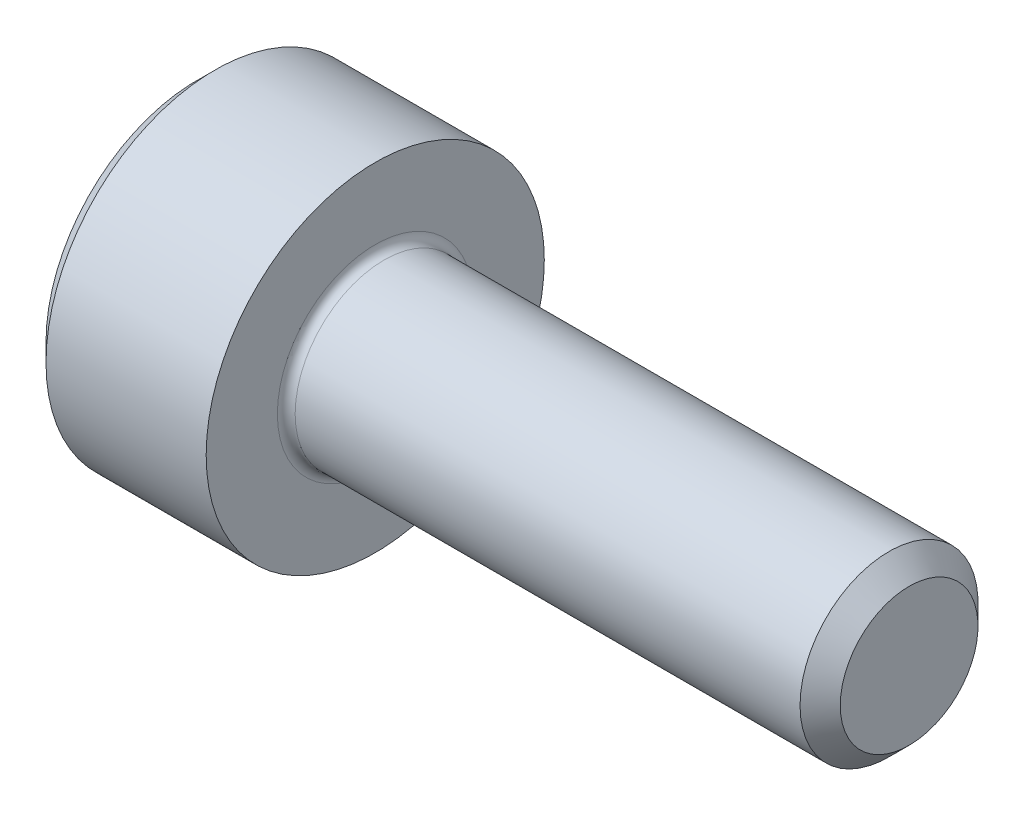
ISO-10303-21;
HEADER;
FILE_DESCRIPTION(('STEP AP214'),'2;1');
FILE_NAME('part.step','',(''),(''),'','','');
FILE_SCHEMA(('AUTOMOTIVE_DESIGN { 1 0 10303 214 1 1 1 1 }'));
ENDSEC;
DATA;
#1=APPLICATION_CONTEXT('core data for automotive mechanical design processes');
#2=APPLICATION_PROTOCOL_DEFINITION('international standard','automotive_design',2000,#1);
#3=PRODUCT_CONTEXT('',#1,'mechanical');
#4=PRODUCT('Part','Part','',(#3));
#5=PRODUCT_RELATED_PRODUCT_CATEGORY('part','',(#4));
#6=PRODUCT_DEFINITION_FORMATION('','',#4);
#7=PRODUCT_DEFINITION_CONTEXT('part definition',#1,'design');
#8=PRODUCT_DEFINITION('design','',#6,#7);
#9=PRODUCT_DEFINITION_SHAPE('','',#8);
#10=(LENGTH_UNIT() NAMED_UNIT(*) SI_UNIT(.MILLI.,.METRE.));
#11=(NAMED_UNIT(*) PLANE_ANGLE_UNIT() SI_UNIT($,.RADIAN.));
#12=(NAMED_UNIT(*) SI_UNIT($,.STERADIAN.) SOLID_ANGLE_UNIT());
#13=UNCERTAINTY_MEASURE_WITH_UNIT(LENGTH_MEASURE(1.E-05),#10,'distance_accuracy_value','');
#14=(GEOMETRIC_REPRESENTATION_CONTEXT(3) GLOBAL_UNCERTAINTY_ASSIGNED_CONTEXT((#13)) GLOBAL_UNIT_ASSIGNED_CONTEXT((#10,
#11,#12)) REPRESENTATION_CONTEXT('',''));
#15=CARTESIAN_POINT('',(0.,0.,0.));
#16=DIRECTION('',(0.,0.,1.));
#17=DIRECTION('',(1.,0.,0.));
#18=AXIS2_PLACEMENT_3D('',#15,#16,#17);
#19=CARTESIAN_POINT('',(0.,0.,0.));
#20=DIRECTION('',(-1.,0.,0.));
#21=DIRECTION('',(0.,0.,1.));
#22=AXIS2_PLACEMENT_3D('',#19,#20,#21);
#23=PLANE('',#22);
#24=DIRECTION('',(0.,-0.499999999999999,0.866025403784439));
#25=VECTOR('',#24,1.);
#26=CARTESIAN_POINT('',(0.,0.892006165897969,0.));
#27=LINE('',#26,#25);
#28=CARTESIAN_POINT('',(0.,0.892006165897969,0.));
#29=VERTEX_POINT('',#28);
#30=CARTESIAN_POINT('',(0.,0.446003082948983,0.772499999999997));
#31=VERTEX_POINT('',#30);
#32=EDGE_CURVE('E387',#29,#31,#27,.T.);
#33=ORIENTED_EDGE('',*,*,#32,.T.);
#34=DIRECTION('',(0.,1.,0.));
#35=VECTOR('',#34,1.);
#36=CARTESIAN_POINT('',(0.,-0.446003082948989,0.772499999999998));
#37=LINE('',#36,#35);
#38=CARTESIAN_POINT('',(0.,-0.446003082948989,0.772499999999998));
#39=VERTEX_POINT('',#38);
#40=EDGE_CURVE('E131',#39,#31,#37,.T.);
#41=ORIENTED_EDGE('',*,*,#40,.F.);
#42=DIRECTION('',(0.,-0.500000000000001,-0.866025403784438));
#43=VECTOR('',#42,1.);
#44=CARTESIAN_POINT('',(0.,-0.446003082948989,0.772499999999998));
#45=LINE('',#44,#43);
#46=CARTESIAN_POINT('',(0.,-0.892006165897975,0.));
#47=VERTEX_POINT('',#46);
#48=EDGE_CURVE('E390',#39,#47,#45,.T.);
#49=ORIENTED_EDGE('',*,*,#48,.T.);
#50=DIRECTION('',(0.,0.499999999999999,-0.866025403784439));
#51=VECTOR('',#50,1.);
#52=CARTESIAN_POINT('',(0.,-0.892006165897975,0.));
#53=LINE('',#52,#51);
#54=CARTESIAN_POINT('',(0.,-0.44600308294899,-0.772500000000001));
#55=VERTEX_POINT('',#54);
#56=EDGE_CURVE('E393',#47,#55,#53,.T.);
#57=ORIENTED_EDGE('',*,*,#56,.T.);
#58=DIRECTION('',(0.,-1.,0.));
#59=VECTOR('',#58,1.);
#60=CARTESIAN_POINT('',(0.,0.446003082948982,-0.772500000000003));
#61=LINE('',#60,#59);
#62=CARTESIAN_POINT('',(0.,0.446003082948982,-0.772500000000003));
#63=VERTEX_POINT('',#62);
#64=EDGE_CURVE('E396',#63,#55,#61,.T.);
#65=ORIENTED_EDGE('',*,*,#64,.F.);
#66=DIRECTION('',(0.,-0.500000000000001,-0.866025403784438));
#67=VECTOR('',#66,1.);
#68=CARTESIAN_POINT('',(0.,0.892006165897969,0.));
#69=LINE('',#68,#67);
#70=EDGE_CURVE('E126',#29,#63,#69,.T.);
#71=ORIENTED_EDGE('',*,*,#70,.F.);
#72=EDGE_LOOP('',(#33,#41,#49,#57,#65,#71));
#73=FACE_BOUND('',#72,.T.);
#74=CARTESIAN_POINT('',(0.,0.,0.));
#75=DIRECTION('',(-1.,0.,0.));
#76=DIRECTION('',(0.,0.,1.));
#77=AXIS2_PLACEMENT_3D('',#74,#75,#76);
#78=CIRCLE('',#77,1.70000000000001);
#79=CARTESIAN_POINT('',(0.,0.,1.70000000000001));
#80=VERTEX_POINT('',#79);
#81=EDGE_CURVE('E142',#80,#80,#78,.T.);
#82=ORIENTED_EDGE('',*,*,#81,.T.);
#83=EDGE_LOOP('',(#82));
#84=FACE_BOUND('',#83,.T.);
#85=ADVANCED_FACE('F35',(#73,#84),#23,.T.);
#86=CARTESIAN_POINT('',(8.,0.774,0.));
#87=DIRECTION('',(1.,0.,0.));
#88=DIRECTION('',(0.,0.,-1.));
#89=AXIS2_PLACEMENT_3D('',#86,#87,#88);
#90=PLANE('',#89);
#91=CARTESIAN_POINT('',(8.,0.,0.));
#92=DIRECTION('',(-1.,0.,0.));
#93=DIRECTION('',(0.,0.,1.));
#94=AXIS2_PLACEMENT_3D('',#91,#92,#93);
#95=CIRCLE('',#94,0.774);
#96=CARTESIAN_POINT('',(8.,0.,0.774));
#97=VERTEX_POINT('',#96);
#98=EDGE_CURVE('E155',#97,#97,#95,.T.);
#99=ORIENTED_EDGE('',*,*,#98,.F.);
#100=EDGE_LOOP('',(#99));
#101=FACE_BOUND('',#100,.T.);
#102=ADVANCED_FACE('F176',(#101),#90,.T.);
#103=CARTESIAN_POINT('',(8.,0.,0.));
#104=DIRECTION('',(-1.,0.,0.));
#105=DIRECTION('',(0.,0.,1.));
#106=AXIS2_PLACEMENT_3D('',#103,#104,#105);
#107=CONICAL_SURFACE('',#106,0.774,0.785398163397411);
#108=CARTESIAN_POINT('',(7.774,0.,0.));
#109=DIRECTION('',(-1.,0.,0.));
#110=DIRECTION('',(0.,0.,1.));
#111=AXIS2_PLACEMENT_3D('',#108,#109,#110);
#112=CIRCLE('',#111,0.999999999999987);
#113=CARTESIAN_POINT('',(7.774,0.,0.999999999999987));
#114=VERTEX_POINT('',#113);
#115=EDGE_CURVE('E152',#114,#114,#112,.T.);
#116=ORIENTED_EDGE('',*,*,#115,.F.);
#117=EDGE_LOOP('',(#116));
#118=FACE_BOUND('',#117,.T.);
#119=ORIENTED_EDGE('',*,*,#98,.T.);
#120=EDGE_LOOP('',(#119));
#121=FACE_BOUND('',#120,.T.);
#122=ADVANCED_FACE('F182',(#118,#121),#107,.T.);
#123=CARTESIAN_POINT('',(-31.75,0.,0.));
#124=DIRECTION('',(-1.,0.,0.));
#125=DIRECTION('',(0.,0.,1.));
#126=AXIS2_PLACEMENT_3D('',#123,#124,#125);
#127=CYLINDRICAL_SURFACE('',#126,0.999999999999994);
#128=CARTESIAN_POINT('',(2.1,0.,0.));
#129=DIRECTION('',(1.,0.,0.));
#130=DIRECTION('',(0.,0.,-1.));
#131=AXIS2_PLACEMENT_3D('',#128,#129,#130);
#132=CIRCLE('',#131,0.999999999999994);
#133=CARTESIAN_POINT('',(2.1,0.,-0.999999999999994));
#134=VERTEX_POINT('',#133);
#135=EDGE_CURVE('E11',#134,#134,#132,.T.);
#136=ORIENTED_EDGE('',*,*,#135,.T.);
#137=EDGE_LOOP('',(#136));
#138=FACE_BOUND('',#137,.T.);
#139=ORIENTED_EDGE('',*,*,#115,.T.);
#140=EDGE_LOOP('',(#139));
#141=FACE_BOUND('',#140,.T.);
#142=ADVANCED_FACE('F193',(#138,#141),#127,.T.);
#143=CARTESIAN_POINT('',(2.,1.9,0.));
#144=DIRECTION('',(1.,0.,0.));
#145=DIRECTION('',(0.,0.,-1.));
#146=AXIS2_PLACEMENT_3D('',#143,#144,#145);
#147=PLANE('',#146);
#148=CARTESIAN_POINT('',(2.,0.,0.));
#149=DIRECTION('',(1.,0.,0.));
#150=DIRECTION('',(0.,0.,-1.));
#151=AXIS2_PLACEMENT_3D('',#148,#149,#150);
#152=CIRCLE('',#151,1.09999999999999);
#153=CARTESIAN_POINT('',(2.,0.,-1.09999999999999));
#154=VERTEX_POINT('',#153);
#155=EDGE_CURVE('E43',#154,#154,#152,.F.);
#156=ORIENTED_EDGE('',*,*,#155,.T.);
#157=EDGE_LOOP('',(#156));
#158=FACE_BOUND('',#157,.T.);
#159=CARTESIAN_POINT('',(2.,0.,0.));
#160=DIRECTION('',(-1.,0.,0.));
#161=DIRECTION('',(0.,0.,1.));
#162=AXIS2_PLACEMENT_3D('',#159,#160,#161);
#163=CIRCLE('',#162,1.9);
#164=CARTESIAN_POINT('',(2.,0.,1.9));
#165=VERTEX_POINT('',#164);
#166=EDGE_CURVE('E149',#165,#165,#163,.T.);
#167=ORIENTED_EDGE('',*,*,#166,.F.);
#168=EDGE_LOOP('',(#167));
#169=FACE_BOUND('',#168,.T.);
#170=ADVANCED_FACE('F160',(#158,#169),#147,.T.);
#171=CARTESIAN_POINT('',(-31.75,0.,0.));
#172=DIRECTION('',(-1.,0.,0.));
#173=DIRECTION('',(0.,0.,1.));
#174=AXIS2_PLACEMENT_3D('',#171,#172,#173);
#175=CYLINDRICAL_SURFACE('',#174,1.9);
#176=ORIENTED_EDGE('',*,*,#166,.T.);
#177=EDGE_LOOP('',(#176));
#178=FACE_BOUND('',#177,.T.);
#179=CARTESIAN_POINT('',(0.199999999999999,0.,0.));
#180=DIRECTION('',(-1.,0.,0.));
#181=DIRECTION('',(0.,0.,1.));
#182=AXIS2_PLACEMENT_3D('',#179,#180,#181);
#183=CIRCLE('',#182,1.9);
#184=CARTESIAN_POINT('',(0.199999999999999,0.,1.9));
#185=VERTEX_POINT('',#184);
#186=EDGE_CURVE('E146',#185,#185,#183,.T.);
#187=ORIENTED_EDGE('',*,*,#186,.F.);
#188=EDGE_LOOP('',(#187));
#189=FACE_BOUND('',#188,.T.);
#190=ADVANCED_FACE('F171',(#178,#189),#175,.T.);
#191=CARTESIAN_POINT('',(0.,0.,0.));
#192=DIRECTION('',(1.,0.,0.));
#193=DIRECTION('',(0.,0.,-1.));
#194=AXIS2_PLACEMENT_3D('',#191,#192,#193);
#195=CONICAL_SURFACE('',#194,1.70000000000001,0.785398163397435);
#196=ORIENTED_EDGE('',*,*,#186,.T.);
#197=EDGE_LOOP('',(#196));
#198=FACE_BOUND('',#197,.T.);
#199=ORIENTED_EDGE('',*,*,#81,.F.);
#200=EDGE_LOOP('',(#199));
#201=FACE_BOUND('',#200,.T.);
#202=ADVANCED_FACE('F164',(#198,#201),#195,.T.);
#203=CARTESIAN_POINT('',(2.1,0.,0.));
#204=DIRECTION('',(1.,0.,0.));
#205=DIRECTION('',(0.,0.,-1.));
#206=AXIS2_PLACEMENT_3D('',#203,#204,#205);
#207=TOROIDAL_SURFACE('',#206,1.09999999999999,0.1);
#208=ORIENTED_EDGE('',*,*,#135,.F.);
#209=EDGE_LOOP('',(#208));
#210=FACE_BOUND('',#209,.T.);
#211=ORIENTED_EDGE('',*,*,#155,.F.);
#212=EDGE_LOOP('',(#211));
#213=FACE_BOUND('',#212,.T.);
#214=ADVANCED_FACE('F37',(#210,#213),#207,.F.);
#215=CARTESIAN_POINT('',(1.,0.892006165897969,0.));
#216=DIRECTION('',(0.,-0.866025403784439,-0.499999999999999));
#217=DIRECTION('',(0.,0.499999999999999,-0.866025403784439));
#218=AXIS2_PLACEMENT_3D('',#215,#216,#217);
#219=PLANE('',#218);
#220=ORIENTED_EDGE('',*,*,#32,.F.);
#221=DIRECTION('',(-1.,0.,0.));
#222=VECTOR('',#221,1.);
#223=CARTESIAN_POINT('',(1.,0.892006165897969,0.));
#224=LINE('',#223,#222);
#225=CARTESIAN_POINT('',(1.,0.892006165897969,0.));
#226=VERTEX_POINT('',#225);
#227=EDGE_CURVE('E377',#226,#29,#224,.T.);
#228=ORIENTED_EDGE('',*,*,#227,.F.);
#229=DIRECTION('',(0.,-0.499999999999999,0.866025403784439));
#230=VECTOR('',#229,1.);
#231=CARTESIAN_POINT('',(1.,0.892006165897969,0.));
#232=LINE('',#231,#230);
#233=CARTESIAN_POINT('',(1.,0.669004624423476,0.386249999999998));
#234=VERTEX_POINT('',#233);
#235=EDGE_CURVE('E118',#226,#234,#232,.T.);
#236=ORIENTED_EDGE('',*,*,#235,.T.);
#237=CARTESIAN_POINT('',(1.,0.446003082948983,0.772499999999997));
#238=VERTEX_POINT('',#237);
#239=EDGE_CURVE('E109',#234,#238,#232,.T.);
#240=ORIENTED_EDGE('',*,*,#239,.T.);
#241=DIRECTION('',(-1.,0.,0.));
#242=VECTOR('',#241,1.);
#243=CARTESIAN_POINT('',(1.,0.446003082948983,0.772499999999997));
#244=LINE('',#243,#242);
#245=EDGE_CURVE('E123',#238,#31,#244,.T.);
#246=ORIENTED_EDGE('',*,*,#245,.T.);
#247=EDGE_LOOP('',(#220,#228,#236,#240,#246));
#248=FACE_BOUND('',#247,.T.);
#249=ADVANCED_FACE('F122',(#248),#219,.T.);
#250=CARTESIAN_POINT('',(1.,-0.446003082948989,0.772499999999998));
#251=DIRECTION('',(0.,0.,1.));
#252=DIRECTION('',(0.,-1.,0.));
#253=AXIS2_PLACEMENT_3D('',#250,#251,#252);
#254=PLANE('',#253);
#255=ORIENTED_EDGE('',*,*,#40,.T.);
#256=ORIENTED_EDGE('',*,*,#245,.F.);
#257=DIRECTION('',(0.,1.,0.));
#258=VECTOR('',#257,1.);
#259=CARTESIAN_POINT('',(1.,-0.446003082948989,0.772499999999998));
#260=LINE('',#259,#258);
#261=CARTESIAN_POINT('',(1.,0.,0.772499999999998));
#262=VERTEX_POINT('',#261);
#263=EDGE_CURVE('E106',#262,#238,#260,.T.);
#264=ORIENTED_EDGE('',*,*,#263,.F.);
#265=CARTESIAN_POINT('',(1.,-0.446003082948989,0.772499999999998));
#266=VERTEX_POINT('',#265);
#267=EDGE_CURVE('E117',#266,#262,#260,.T.);
#268=ORIENTED_EDGE('',*,*,#267,.F.);
#269=DIRECTION('',(-1.,0.,0.));
#270=VECTOR('',#269,1.);
#271=CARTESIAN_POINT('',(1.,-0.446003082948989,0.772499999999998));
#272=LINE('',#271,#270);
#273=EDGE_CURVE('E133',#266,#39,#272,.T.);
#274=ORIENTED_EDGE('',*,*,#273,.T.);
#275=EDGE_LOOP('',(#255,#256,#264,#268,#274));
#276=FACE_BOUND('',#275,.T.);
#277=ADVANCED_FACE('F128',(#276),#254,.F.);
#278=CARTESIAN_POINT('',(1.,-0.446003082948989,0.772499999999998));
#279=DIRECTION('',(0.,0.866025403784438,-0.500000000000001));
#280=DIRECTION('',(0.,0.500000000000001,0.866025403784438));
#281=AXIS2_PLACEMENT_3D('',#278,#279,#280);
#282=PLANE('',#281);
#283=ORIENTED_EDGE('',*,*,#48,.F.);
#284=ORIENTED_EDGE('',*,*,#273,.F.);
#285=DIRECTION('',(0.,-0.500000000000001,-0.866025403784438));
#286=VECTOR('',#285,1.);
#287=CARTESIAN_POINT('',(1.,-0.446003082948989,0.772499999999998));
#288=LINE('',#287,#286);
#289=CARTESIAN_POINT('',(1.,-0.66900462442348,0.386250000000002));
#290=VERTEX_POINT('',#289);
#291=EDGE_CURVE('E416',#266,#290,#288,.T.);
#292=ORIENTED_EDGE('',*,*,#291,.T.);
#293=CARTESIAN_POINT('',(1.,-0.892006165897975,0.));
#294=VERTEX_POINT('',#293);
#295=EDGE_CURVE('E405',#290,#294,#288,.T.);
#296=ORIENTED_EDGE('',*,*,#295,.T.);
#297=DIRECTION('',(-1.,0.,0.));
#298=VECTOR('',#297,1.);
#299=CARTESIAN_POINT('',(1.,-0.892006165897975,0.));
#300=LINE('',#299,#298);
#301=EDGE_CURVE('E138',#294,#47,#300,.T.);
#302=ORIENTED_EDGE('',*,*,#301,.T.);
#303=EDGE_LOOP('',(#283,#284,#292,#296,#302));
#304=FACE_BOUND('',#303,.T.);
#305=ADVANCED_FACE('F268',(#304),#282,.T.);
#306=CARTESIAN_POINT('',(1.,-0.892006165897975,0.));
#307=DIRECTION('',(0.,0.866025403784439,0.5));
#308=DIRECTION('',(0.,-0.499999999999999,0.866025403784439));
#309=AXIS2_PLACEMENT_3D('',#306,#307,#308);
#310=PLANE('',#309);
#311=ORIENTED_EDGE('',*,*,#56,.F.);
#312=ORIENTED_EDGE('',*,*,#301,.F.);
#313=DIRECTION('',(0.,0.499999999999999,-0.866025403784439));
#314=VECTOR('',#313,1.);
#315=CARTESIAN_POINT('',(1.,-0.892006165897975,0.));
#316=LINE('',#315,#314);
#317=CARTESIAN_POINT('',(1.,-0.669004624423482,-0.386250000000001));
#318=VERTEX_POINT('',#317);
#319=EDGE_CURVE('E383',#294,#318,#316,.T.);
#320=ORIENTED_EDGE('',*,*,#319,.T.);
#321=CARTESIAN_POINT('',(1.,-0.44600308294899,-0.772500000000001));
#322=VERTEX_POINT('',#321);
#323=EDGE_CURVE('E415',#318,#322,#316,.T.);
#324=ORIENTED_EDGE('',*,*,#323,.T.);
#325=DIRECTION('',(-1.,0.,0.));
#326=VECTOR('',#325,1.);
#327=CARTESIAN_POINT('',(1.,-0.44600308294899,-0.772500000000001));
#328=LINE('',#327,#326);
#329=EDGE_CURVE('E376',#322,#55,#328,.T.);
#330=ORIENTED_EDGE('',*,*,#329,.T.);
#331=EDGE_LOOP('',(#311,#312,#320,#324,#330));
#332=FACE_BOUND('',#331,.T.);
#333=ADVANCED_FACE('F276',(#332),#310,.T.);
#334=CARTESIAN_POINT('',(1.,0.446003082948982,-0.772500000000003));
#335=DIRECTION('',(0.,0.,-1.));
#336=DIRECTION('',(0.,1.,0.));
#337=AXIS2_PLACEMENT_3D('',#334,#335,#336);
#338=PLANE('',#337);
#339=ORIENTED_EDGE('',*,*,#64,.T.);
#340=ORIENTED_EDGE('',*,*,#329,.F.);
#341=DIRECTION('',(0.,-1.,0.));
#342=VECTOR('',#341,1.);
#343=CARTESIAN_POINT('',(1.,0.446003082948982,-0.772500000000003));
#344=LINE('',#343,#342);
#345=CARTESIAN_POINT('',(1.,0.,-0.772500000000002));
#346=VERTEX_POINT('',#345);
#347=EDGE_CURVE('E380',#346,#322,#344,.T.);
#348=ORIENTED_EDGE('',*,*,#347,.F.);
#349=CARTESIAN_POINT('',(1.,0.446003082948982,-0.772500000000003));
#350=VERTEX_POINT('',#349);
#351=EDGE_CURVE('E50',#350,#346,#344,.T.);
#352=ORIENTED_EDGE('',*,*,#351,.F.);
#353=DIRECTION('',(-1.,0.,0.));
#354=VECTOR('',#353,1.);
#355=CARTESIAN_POINT('',(1.,0.446003082948982,-0.772500000000003));
#356=LINE('',#355,#354);
#357=EDGE_CURVE('E373',#350,#63,#356,.T.);
#358=ORIENTED_EDGE('',*,*,#357,.T.);
#359=EDGE_LOOP('',(#339,#340,#348,#352,#358));
#360=FACE_BOUND('',#359,.T.);
#361=ADVANCED_FACE('F285',(#360),#338,.F.);
#362=CARTESIAN_POINT('',(1.,0.892006165897969,0.));
#363=DIRECTION('',(0.,0.866025403784438,-0.500000000000001));
#364=DIRECTION('',(0.,0.500000000000001,0.866025403784438));
#365=AXIS2_PLACEMENT_3D('',#362,#363,#364);
#366=PLANE('',#365);
#367=ORIENTED_EDGE('',*,*,#70,.T.);
#368=ORIENTED_EDGE('',*,*,#357,.F.);
#369=DIRECTION('',(0.,-0.500000000000001,-0.866025403784438));
#370=VECTOR('',#369,1.);
#371=CARTESIAN_POINT('',(1.,0.892006165897969,0.));
#372=LINE('',#371,#370);
#373=CARTESIAN_POINT('',(1.,0.669004624423477,-0.38625));
#374=VERTEX_POINT('',#373);
#375=EDGE_CURVE('E363',#374,#350,#372,.T.);
#376=ORIENTED_EDGE('',*,*,#375,.F.);
#377=EDGE_CURVE('E369',#226,#374,#372,.T.);
#378=ORIENTED_EDGE('',*,*,#377,.F.);
#379=ORIENTED_EDGE('',*,*,#227,.T.);
#380=EDGE_LOOP('',(#367,#368,#376,#378,#379));
#381=FACE_BOUND('',#380,.T.);
#382=ADVANCED_FACE('F294',(#381),#366,.F.);
#383=CARTESIAN_POINT('',(1.,0.,1.545));
#384=DIRECTION('',(1.,0.,0.));
#385=DIRECTION('',(0.,0.,-1.));
#386=AXIS2_PLACEMENT_3D('',#383,#384,#385);
#387=PLANE('',#386);
#388=ORIENTED_EDGE('',*,*,#347,.T.);
#389=ORIENTED_EDGE('',*,*,#323,.F.);
#390=CARTESIAN_POINT('',(1.,0.,0.));
#391=DIRECTION('',(-1.,0.,0.));
#392=DIRECTION('',(0.,0.,1.));
#393=AXIS2_PLACEMENT_3D('',#390,#391,#392);
#394=CIRCLE('',#393,0.772500000000002);
#395=EDGE_CURVE('E411',#346,#318,#394,.T.);
#396=ORIENTED_EDGE('',*,*,#395,.F.);
#397=EDGE_LOOP('',(#388,#389,#396));
#398=FACE_BOUND('',#397,.T.);
#399=ADVANCED_FACE('F303',(#398),#387,.F.);
#400=ORIENTED_EDGE('',*,*,#319,.F.);
#401=ORIENTED_EDGE('',*,*,#295,.F.);
#402=EDGE_CURVE('E136',#318,#290,#394,.T.);
#403=ORIENTED_EDGE('',*,*,#402,.F.);
#404=EDGE_LOOP('',(#400,#401,#403));
#405=FACE_BOUND('',#404,.T.);
#406=ADVANCED_FACE('F312',(#405),#387,.F.);
#407=ORIENTED_EDGE('',*,*,#291,.F.);
#408=ORIENTED_EDGE('',*,*,#267,.T.);
#409=EDGE_CURVE('E132',#290,#262,#394,.T.);
#410=ORIENTED_EDGE('',*,*,#409,.F.);
#411=EDGE_LOOP('',(#407,#408,#410));
#412=FACE_BOUND('',#411,.T.);
#413=ADVANCED_FACE('F321',(#412),#387,.F.);
#414=ORIENTED_EDGE('',*,*,#263,.T.);
#415=ORIENTED_EDGE('',*,*,#239,.F.);
#416=EDGE_CURVE('E112',#262,#234,#394,.T.);
#417=ORIENTED_EDGE('',*,*,#416,.F.);
#418=EDGE_LOOP('',(#414,#415,#417));
#419=FACE_BOUND('',#418,.T.);
#420=ADVANCED_FACE('F108',(#419),#387,.F.);
#421=ORIENTED_EDGE('',*,*,#235,.F.);
#422=ORIENTED_EDGE('',*,*,#377,.T.);
#423=EDGE_CURVE('E143',#234,#374,#394,.T.);
#424=ORIENTED_EDGE('',*,*,#423,.F.);
#425=EDGE_LOOP('',(#421,#422,#424));
#426=FACE_BOUND('',#425,.T.);
#427=ADVANCED_FACE('F336',(#426),#387,.F.);
#428=ORIENTED_EDGE('',*,*,#375,.T.);
#429=ORIENTED_EDGE('',*,*,#351,.T.);
#430=EDGE_CURVE('E366',#374,#346,#394,.T.);
#431=ORIENTED_EDGE('',*,*,#430,.F.);
#432=EDGE_LOOP('',(#428,#429,#431));
#433=FACE_BOUND('',#432,.T.);
#434=ADVANCED_FACE('F251',(#433),#387,.F.);
#435=CARTESIAN_POINT('',(1.,0.,0.));
#436=DIRECTION('',(-1.,0.,0.));
#437=DIRECTION('',(0.,0.,1.));
#438=AXIS2_PLACEMENT_3D('',#435,#436,#437);
#439=CONICAL_SURFACE('',#438,0.772500000000002,1.04719755119659);
#440=CARTESIAN_POINT('',(1.446003082949,0.,0.));
#441=VERTEX_POINT('',#440);
#442=VERTEX_LOOP('',#441);
#443=FACE_BOUND('',#442,.T.);
#444=ORIENTED_EDGE('',*,*,#416,.T.);
#445=ORIENTED_EDGE('',*,*,#423,.T.);
#446=ORIENTED_EDGE('',*,*,#430,.T.);
#447=ORIENTED_EDGE('',*,*,#395,.T.);
#448=ORIENTED_EDGE('',*,*,#402,.T.);
#449=ORIENTED_EDGE('',*,*,#409,.T.);
#450=EDGE_LOOP('',(#444,#445,#446,#447,#448,#449));
#451=FACE_BOUND('',#450,.T.);
#452=ADVANCED_FACE('F186',(#443,#451),#439,.F.);
#453=CLOSED_SHELL('',(#85,#102,#122,#142,#170,#190,#202,#214,#249,#277,#305,#333,#361,#382,#399,
#406,#413,#420,#427,#434,#452));
#454=MANIFOLD_SOLID_BREP('B2',#453);
#455=ADVANCED_BREP_SHAPE_REPRESENTATION('',(#18,#454),#14);
#456=SHAPE_DEFINITION_REPRESENTATION(#9,#455);
ENDSEC;
END-ISO-10303-21;
